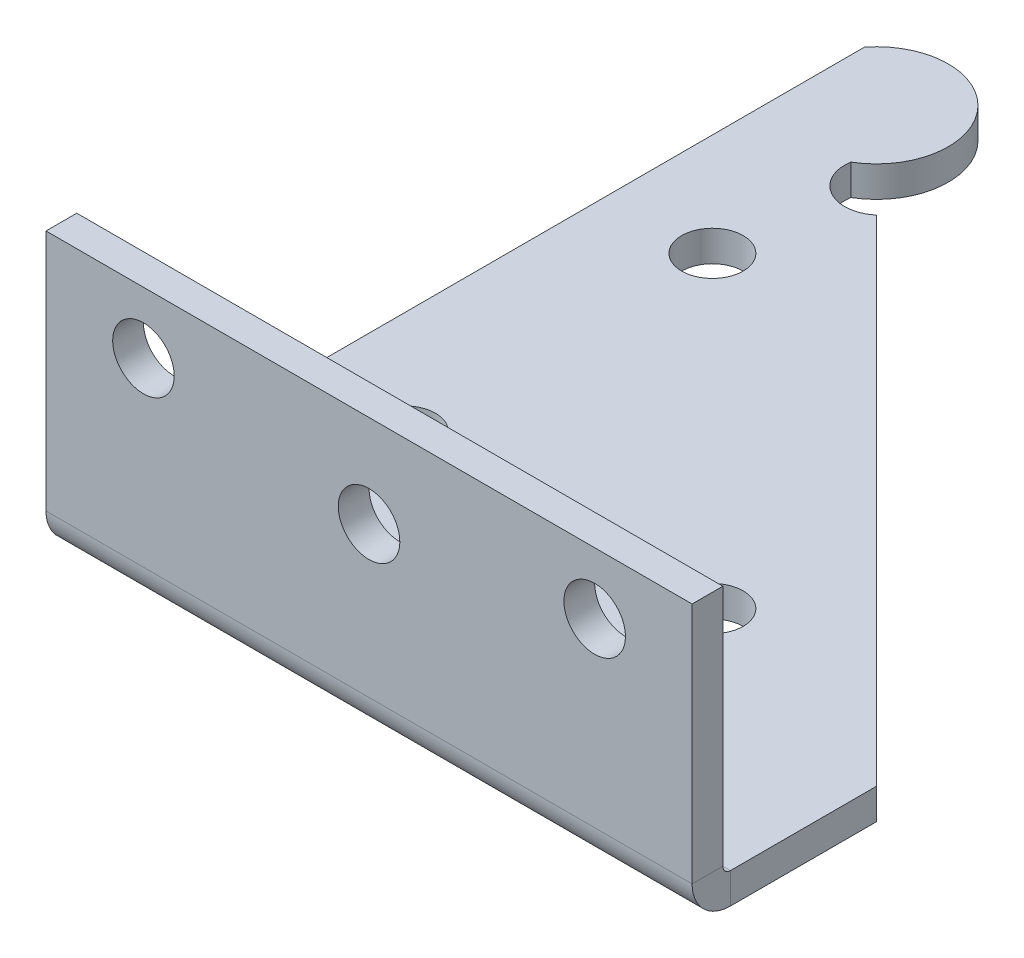
ISO-10303-21;
HEADER;
FILE_DESCRIPTION(('STEP AP214'),'2;1');
FILE_NAME('part.step','',(''),(''),'','','');
FILE_SCHEMA(('AUTOMOTIVE_DESIGN { 1 0 10303 214 1 1 1 1 }'));
ENDSEC;
DATA;
#1=APPLICATION_CONTEXT('core data for automotive mechanical design processes');
#2=APPLICATION_PROTOCOL_DEFINITION('international standard','automotive_design',2000,#1);
#3=PRODUCT_CONTEXT('',#1,'mechanical');
#4=PRODUCT('Part','Part','',(#3));
#5=PRODUCT_RELATED_PRODUCT_CATEGORY('part','',(#4));
#6=PRODUCT_DEFINITION_FORMATION('','',#4);
#7=PRODUCT_DEFINITION_CONTEXT('part definition',#1,'design');
#8=PRODUCT_DEFINITION('design','',#6,#7);
#9=PRODUCT_DEFINITION_SHAPE('','',#8);
#10=(LENGTH_UNIT() NAMED_UNIT(*) SI_UNIT(.MILLI.,.METRE.));
#11=(NAMED_UNIT(*) PLANE_ANGLE_UNIT() SI_UNIT($,.RADIAN.));
#12=(NAMED_UNIT(*) SI_UNIT($,.STERADIAN.) SOLID_ANGLE_UNIT());
#13=UNCERTAINTY_MEASURE_WITH_UNIT(LENGTH_MEASURE(1.E-05),#10,'distance_accuracy_value','');
#14=(GEOMETRIC_REPRESENTATION_CONTEXT(3) GLOBAL_UNCERTAINTY_ASSIGNED_CONTEXT((#13)) GLOBAL_UNIT_ASSIGNED_CONTEXT((#10,
#11,#12)) REPRESENTATION_CONTEXT('',''));
#15=CARTESIAN_POINT('',(0.,0.,0.));
#16=DIRECTION('',(0.,0.,1.));
#17=DIRECTION('',(1.,0.,0.));
#18=AXIS2_PLACEMENT_3D('',#15,#16,#17);
#19=CARTESIAN_POINT('',(5.50000000000001,-74.5200215322547,-23.4200215322545));
#20=DIRECTION('',(0.,0.,-1.));
#21=DIRECTION('',(0.,1.,0.));
#22=AXIS2_PLACEMENT_3D('',#19,#20,#21);
#23=PLANE('',#22);
#24=CARTESIAN_POINT('',(53.5,18.3799784677453,-23.4200215322548));
#25=DIRECTION('',(0.,0.,-1.));
#26=DIRECTION('',(0.,1.,0.));
#27=AXIS2_PLACEMENT_3D('',#24,#25,#26);
#28=CIRCLE('',#27,3.);
#29=CARTESIAN_POINT('',(53.5,21.3799784677453,-23.4200215322548));
#30=VERTEX_POINT('',#29);
#31=EDGE_CURVE('E213',#30,#30,#28,.T.);
#32=ORIENTED_EDGE('',*,*,#31,.T.);
#33=EDGE_LOOP('',(#32));
#34=FACE_BOUND('',#33,.T.);
#35=CARTESIAN_POINT('',(9.5,18.3799784677453,-23.4200215322548));
#36=DIRECTION('',(0.,0.,-1.));
#37=DIRECTION('',(0.,1.,0.));
#38=AXIS2_PLACEMENT_3D('',#35,#36,#37);
#39=CIRCLE('',#38,3.);
#40=CARTESIAN_POINT('',(9.5,21.3799784677453,-23.4200215322548));
#41=VERTEX_POINT('',#40);
#42=EDGE_CURVE('E207',#41,#41,#39,.T.);
#43=ORIENTED_EDGE('',*,*,#42,.T.);
#44=EDGE_LOOP('',(#43));
#45=FACE_BOUND('',#44,.T.);
#46=CARTESIAN_POINT('',(31.5,15.3799784677453,-23.4200215322548));
#47=DIRECTION('',(0.,0.,-1.));
#48=DIRECTION('',(0.,1.,0.));
#49=AXIS2_PLACEMENT_3D('',#46,#47,#48);
#50=CIRCLE('',#49,3.);
#51=CARTESIAN_POINT('',(31.5,18.3799784677453,-23.4200215322548));
#52=VERTEX_POINT('',#51);
#53=EDGE_CURVE('E200',#52,#52,#50,.T.);
#54=ORIENTED_EDGE('',*,*,#53,.T.);
#55=EDGE_LOOP('',(#54));
#56=FACE_BOUND('',#55,.T.);
#57=DIRECTION('',(0.,1.,0.));
#58=VECTOR('',#57,1.);
#59=CARTESIAN_POINT('',(0.,24.3799784677453,-23.4200215322548));
#60=LINE('',#59,#58);
#61=CARTESIAN_POINT('',(0.,0.736600000000011,-23.4200215322547));
#62=VERTEX_POINT('',#61);
#63=CARTESIAN_POINT('',(0.,24.3799784677453,-23.4200215322548));
#64=VERTEX_POINT('',#63);
#65=EDGE_CURVE('E47',#62,#64,#60,.T.);
#66=ORIENTED_EDGE('',*,*,#65,.F.);
#67=DIRECTION('',(1.,0.,0.));
#68=VECTOR('',#67,1.);
#69=CARTESIAN_POINT('',(5.50000000000001,0.736600000000014,-23.4200215322547));
#70=LINE('',#69,#68);
#71=CARTESIAN_POINT('',(63.,0.736600000000011,-23.4200215322547));
#72=VERTEX_POINT('',#71);
#73=EDGE_CURVE('E146',#62,#72,#70,.T.);
#74=ORIENTED_EDGE('',*,*,#73,.T.);
#75=DIRECTION('',(0.,-1.,0.));
#76=VECTOR('',#75,1.);
#77=CARTESIAN_POINT('',(63.,24.3799784677453,-23.4200215322548));
#78=LINE('',#77,#76);
#79=CARTESIAN_POINT('',(63.,24.3799784677453,-23.4200215322548));
#80=VERTEX_POINT('',#79);
#81=EDGE_CURVE('E219',#80,#72,#78,.T.);
#82=ORIENTED_EDGE('',*,*,#81,.F.);
#83=DIRECTION('',(1.,0.,0.));
#84=VECTOR('',#83,1.);
#85=CARTESIAN_POINT('',(0.,24.3799784677453,-23.4200215322548));
#86=LINE('',#85,#84);
#87=EDGE_CURVE('E216',#64,#80,#86,.T.);
#88=ORIENTED_EDGE('',*,*,#87,.F.);
#89=EDGE_LOOP('',(#66,#74,#82,#88));
#90=FACE_BOUND('',#89,.T.);
#91=ADVANCED_FACE('F43',(#34,#45,#56,#90),#23,.F.);
#92=CARTESIAN_POINT('',(0.,24.3799784677453,-23.4200215322548));
#93=DIRECTION('',(-1.,0.,0.));
#94=DIRECTION('',(0.,1.,0.));
#95=AXIS2_PLACEMENT_3D('',#92,#93,#94);
#96=PLANE('',#95);
#97=DIRECTION('',(0.,0.,-1.));
#98=VECTOR('',#97,1.);
#99=CARTESIAN_POINT('',(0.,0.736600000000025,-23.4200215322547));
#100=LINE('',#99,#98);
#101=CARTESIAN_POINT('',(0.,0.7366,-26.4200215322547));
#102=VERTEX_POINT('',#101);
#103=EDGE_CURVE('E227',#62,#102,#100,.T.);
#104=ORIENTED_EDGE('',*,*,#103,.F.);
#105=ORIENTED_EDGE('',*,*,#65,.T.);
#106=DIRECTION('',(0.,0.,-1.));
#107=VECTOR('',#106,1.);
#108=CARTESIAN_POINT('',(0.,24.3799784677453,-23.4200215322548));
#109=LINE('',#108,#107);
#110=CARTESIAN_POINT('',(0.,24.3799784677453,-26.4200215322548));
#111=VERTEX_POINT('',#110);
#112=EDGE_CURVE('E224',#64,#111,#109,.T.);
#113=ORIENTED_EDGE('',*,*,#112,.T.);
#114=DIRECTION('',(0.,1.,0.));
#115=VECTOR('',#114,1.);
#116=CARTESIAN_POINT('',(0.,24.3799784677453,-26.4200215322548));
#117=LINE('',#116,#115);
#118=EDGE_CURVE('E68',#102,#111,#117,.T.);
#119=ORIENTED_EDGE('',*,*,#118,.F.);
#120=EDGE_LOOP('',(#104,#105,#113,#119));
#121=FACE_BOUND('',#120,.T.);
#122=ADVANCED_FACE('F236',(#121),#96,.T.);
#123=CARTESIAN_POINT('',(63.,24.3799784677453,-23.4200215322548));
#124=DIRECTION('',(1.,0.,0.));
#125=DIRECTION('',(0.,-1.,0.));
#126=AXIS2_PLACEMENT_3D('',#123,#124,#125);
#127=PLANE('',#126);
#128=DIRECTION('',(0.,0.,1.));
#129=VECTOR('',#128,1.);
#130=CARTESIAN_POINT('',(63.,0.736600000000025,-23.4200215322548));
#131=LINE('',#130,#129);
#132=CARTESIAN_POINT('',(63.,0.736600000000007,-26.4200215322548));
#133=VERTEX_POINT('',#132);
#134=EDGE_CURVE('E12',#133,#72,#131,.T.);
#135=ORIENTED_EDGE('',*,*,#134,.F.);
#136=DIRECTION('',(0.,-1.,0.));
#137=VECTOR('',#136,1.);
#138=CARTESIAN_POINT('',(63.,24.3799784677453,-26.4200215322548));
#139=LINE('',#138,#137);
#140=CARTESIAN_POINT('',(63.,24.3799784677453,-26.4200215322548));
#141=VERTEX_POINT('',#140);
#142=EDGE_CURVE('E60',#141,#133,#139,.T.);
#143=ORIENTED_EDGE('',*,*,#142,.F.);
#144=DIRECTION('',(0.,0.,-1.));
#145=VECTOR('',#144,1.);
#146=CARTESIAN_POINT('',(63.,24.3799784677453,-23.4200215322548));
#147=LINE('',#146,#145);
#148=EDGE_CURVE('E222',#80,#141,#147,.T.);
#149=ORIENTED_EDGE('',*,*,#148,.F.);
#150=ORIENTED_EDGE('',*,*,#81,.T.);
#151=EDGE_LOOP('',(#135,#143,#149,#150));
#152=FACE_BOUND('',#151,.T.);
#153=ADVANCED_FACE('F45',(#152),#127,.T.);
#154=CARTESIAN_POINT('',(0.,24.3799784677453,-23.4200215322548));
#155=DIRECTION('',(0.,1.,0.));
#156=DIRECTION('',(1.,0.,0.));
#157=AXIS2_PLACEMENT_3D('',#154,#155,#156);
#158=PLANE('',#157);
#159=DIRECTION('',(1.,0.,0.));
#160=VECTOR('',#159,1.);
#161=CARTESIAN_POINT('',(0.,24.3799784677453,-26.4200215322548));
#162=LINE('',#161,#160);
#163=EDGE_CURVE('E220',#111,#141,#162,.T.);
#164=ORIENTED_EDGE('',*,*,#163,.F.);
#165=ORIENTED_EDGE('',*,*,#112,.F.);
#166=ORIENTED_EDGE('',*,*,#87,.T.);
#167=ORIENTED_EDGE('',*,*,#148,.T.);
#168=EDGE_LOOP('',(#164,#165,#166,#167));
#169=FACE_BOUND('',#168,.T.);
#170=ADVANCED_FACE('F239',(#169),#158,.T.);
#171=CARTESIAN_POINT('',(5.50000000000001,-74.5200215322547,-26.4200215322545));
#172=DIRECTION('',(0.,0.,-1.));
#173=DIRECTION('',(0.,1.,0.));
#174=AXIS2_PLACEMENT_3D('',#171,#172,#173);
#175=PLANE('',#174);
#176=DIRECTION('',(1.,0.,0.));
#177=VECTOR('',#176,1.);
#178=CARTESIAN_POINT('',(5.50000000000001,0.736600000000004,-26.4200215322547));
#179=LINE('',#178,#177);
#180=EDGE_CURVE('E52',#102,#133,#179,.T.);
#181=ORIENTED_EDGE('',*,*,#180,.F.);
#182=ORIENTED_EDGE('',*,*,#118,.T.);
#183=ORIENTED_EDGE('',*,*,#163,.T.);
#184=ORIENTED_EDGE('',*,*,#142,.T.);
#185=EDGE_LOOP('',(#181,#182,#183,#184));
#186=FACE_BOUND('',#185,.T.);
#187=CARTESIAN_POINT('',(31.5,15.3799784677453,-26.4200215322548));
#188=DIRECTION('',(0.,0.,-1.));
#189=DIRECTION('',(0.,1.,0.));
#190=AXIS2_PLACEMENT_3D('',#187,#188,#189);
#191=CIRCLE('',#190,3.);
#192=CARTESIAN_POINT('',(31.5,18.3799784677453,-26.4200215322548));
#193=VERTEX_POINT('',#192);
#194=EDGE_CURVE('E197',#193,#193,#191,.T.);
#195=ORIENTED_EDGE('',*,*,#194,.F.);
#196=EDGE_LOOP('',(#195));
#197=FACE_BOUND('',#196,.T.);
#198=CARTESIAN_POINT('',(9.5,18.3799784677453,-26.4200215322548));
#199=DIRECTION('',(0.,0.,-1.));
#200=DIRECTION('',(0.,1.,0.));
#201=AXIS2_PLACEMENT_3D('',#198,#199,#200);
#202=CIRCLE('',#201,3.);
#203=CARTESIAN_POINT('',(9.5,21.3799784677453,-26.4200215322548));
#204=VERTEX_POINT('',#203);
#205=EDGE_CURVE('E204',#204,#204,#202,.T.);
#206=ORIENTED_EDGE('',*,*,#205,.F.);
#207=EDGE_LOOP('',(#206));
#208=FACE_BOUND('',#207,.T.);
#209=CARTESIAN_POINT('',(53.5,18.3799784677453,-26.4200215322548));
#210=DIRECTION('',(0.,0.,-1.));
#211=DIRECTION('',(0.,1.,0.));
#212=AXIS2_PLACEMENT_3D('',#209,#210,#211);
#213=CIRCLE('',#212,3.);
#214=CARTESIAN_POINT('',(53.5,21.3799784677453,-26.4200215322548));
#215=VERTEX_POINT('',#214);
#216=EDGE_CURVE('E210',#215,#215,#213,.T.);
#217=ORIENTED_EDGE('',*,*,#216,.F.);
#218=EDGE_LOOP('',(#217));
#219=FACE_BOUND('',#218,.T.);
#220=ADVANCED_FACE('F232',(#186,#197,#208,#219),#175,.T.);
#221=CARTESIAN_POINT('',(53.5,18.3799784677453,-20.4200215322548));
#222=DIRECTION('',(0.,0.,-1.));
#223=DIRECTION('',(0.,1.,0.));
#224=AXIS2_PLACEMENT_3D('',#221,#222,#223);
#225=CYLINDRICAL_SURFACE('',#224,3.);
#226=ORIENTED_EDGE('',*,*,#216,.T.);
#227=EDGE_LOOP('',(#226));
#228=FACE_BOUND('',#227,.T.);
#229=ORIENTED_EDGE('',*,*,#31,.F.);
#230=EDGE_LOOP('',(#229));
#231=FACE_BOUND('',#230,.T.);
#232=ADVANCED_FACE('F307',(#228,#231),#225,.F.);
#233=CARTESIAN_POINT('',(9.5,18.3799784677453,-20.4200215322548));
#234=DIRECTION('',(0.,0.,-1.));
#235=DIRECTION('',(0.,1.,0.));
#236=AXIS2_PLACEMENT_3D('',#233,#234,#235);
#237=CYLINDRICAL_SURFACE('',#236,3.);
#238=ORIENTED_EDGE('',*,*,#205,.T.);
#239=EDGE_LOOP('',(#238));
#240=FACE_BOUND('',#239,.T.);
#241=ORIENTED_EDGE('',*,*,#42,.F.);
#242=EDGE_LOOP('',(#241));
#243=FACE_BOUND('',#242,.T.);
#244=ADVANCED_FACE('F312',(#240,#243),#237,.F.);
#245=CARTESIAN_POINT('',(31.5,15.3799784677453,-20.4200215322548));
#246=DIRECTION('',(0.,0.,-1.));
#247=DIRECTION('',(0.,1.,0.));
#248=AXIS2_PLACEMENT_3D('',#245,#246,#247);
#249=CYLINDRICAL_SURFACE('',#248,3.);
#250=ORIENTED_EDGE('',*,*,#194,.T.);
#251=EDGE_LOOP('',(#250));
#252=FACE_BOUND('',#251,.T.);
#253=ORIENTED_EDGE('',*,*,#53,.F.);
#254=EDGE_LOOP('',(#253));
#255=FACE_BOUND('',#254,.T.);
#256=ADVANCED_FACE('F468',(#252,#255),#249,.F.);
#257=CARTESIAN_POINT('',(40.,-3.,-48.4));
#258=DIRECTION('',(0.,1.,0.));
#259=DIRECTION('',(0.,0.,1.));
#260=AXIS2_PLACEMENT_3D('',#257,#258,#259);
#261=CYLINDRICAL_SURFACE('',#260,3.);
#262=CARTESIAN_POINT('',(40.,-3.,-48.4));
#263=DIRECTION('',(0.,1.,0.));
#264=DIRECTION('',(0.,0.,1.));
#265=AXIS2_PLACEMENT_3D('',#262,#263,#264);
#266=CIRCLE('',#265,3.);
#267=CARTESIAN_POINT('',(40.,-3.,-45.4));
#268=VERTEX_POINT('',#267);
#269=EDGE_CURVE('E164',#268,#268,#266,.T.);
#270=ORIENTED_EDGE('',*,*,#269,.F.);
#271=EDGE_LOOP('',(#270));
#272=FACE_BOUND('',#271,.T.);
#273=CARTESIAN_POINT('',(40.,0.,-48.4));
#274=DIRECTION('',(0.,1.,0.));
#275=DIRECTION('',(0.,0.,1.));
#276=AXIS2_PLACEMENT_3D('',#273,#274,#275);
#277=CIRCLE('',#276,3.);
#278=CARTESIAN_POINT('',(40.,0.,-45.4));
#279=VERTEX_POINT('',#278);
#280=EDGE_CURVE('E160',#279,#279,#277,.T.);
#281=ORIENTED_EDGE('',*,*,#280,.T.);
#282=EDGE_LOOP('',(#281));
#283=FACE_BOUND('',#282,.T.);
#284=ADVANCED_FACE('F459',(#272,#283),#261,.F.);
#285=CARTESIAN_POINT('',(10.,-3.,-48.4));
#286=DIRECTION('',(0.,1.,0.));
#287=DIRECTION('',(0.,0.,1.));
#288=AXIS2_PLACEMENT_3D('',#285,#286,#287);
#289=CYLINDRICAL_SURFACE('',#288,3.);
#290=CARTESIAN_POINT('',(10.,-3.,-48.4));
#291=DIRECTION('',(0.,1.,0.));
#292=DIRECTION('',(0.,0.,1.));
#293=AXIS2_PLACEMENT_3D('',#290,#291,#292);
#294=CIRCLE('',#293,3.);
#295=CARTESIAN_POINT('',(10.,-3.,-45.4));
#296=VERTEX_POINT('',#295);
#297=EDGE_CURVE('E167',#296,#296,#294,.T.);
#298=ORIENTED_EDGE('',*,*,#297,.F.);
#299=EDGE_LOOP('',(#298));
#300=FACE_BOUND('',#299,.T.);
#301=CARTESIAN_POINT('',(10.,0.,-48.4));
#302=DIRECTION('',(0.,1.,0.));
#303=DIRECTION('',(0.,0.,1.));
#304=AXIS2_PLACEMENT_3D('',#301,#302,#303);
#305=CIRCLE('',#304,3.);
#306=CARTESIAN_POINT('',(10.,0.,-45.4));
#307=VERTEX_POINT('',#306);
#308=EDGE_CURVE('E192',#307,#307,#305,.T.);
#309=ORIENTED_EDGE('',*,*,#308,.T.);
#310=EDGE_LOOP('',(#309));
#311=FACE_BOUND('',#310,.T.);
#312=ADVANCED_FACE('F449',(#300,#311),#289,.F.);
#313=CARTESIAN_POINT('',(10.,-6.,-78.4));
#314=DIRECTION('',(0.,1.,0.));
#315=DIRECTION('',(0.,0.,1.));
#316=AXIS2_PLACEMENT_3D('',#313,#314,#315);
#317=CYLINDRICAL_SURFACE('',#316,3.);
#318=CARTESIAN_POINT('',(10.,0.,-78.4));
#319=DIRECTION('',(0.,1.,0.));
#320=DIRECTION('',(0.,0.,1.));
#321=AXIS2_PLACEMENT_3D('',#318,#319,#320);
#322=CIRCLE('',#321,3.);
#323=CARTESIAN_POINT('',(10.,0.,-75.4));
#324=VERTEX_POINT('',#323);
#325=EDGE_CURVE('E189',#324,#324,#322,.T.);
#326=ORIENTED_EDGE('',*,*,#325,.T.);
#327=EDGE_LOOP('',(#326));
#328=FACE_BOUND('',#327,.T.);
#329=CARTESIAN_POINT('',(10.,-3.,-78.4));
#330=DIRECTION('',(0.,1.,0.));
#331=DIRECTION('',(0.,0.,1.));
#332=AXIS2_PLACEMENT_3D('',#329,#330,#331);
#333=CIRCLE('',#332,3.);
#334=CARTESIAN_POINT('',(10.,-3.,-75.4));
#335=VERTEX_POINT('',#334);
#336=EDGE_CURVE('E173',#335,#335,#333,.T.);
#337=ORIENTED_EDGE('',*,*,#336,.F.);
#338=EDGE_LOOP('',(#337));
#339=FACE_BOUND('',#338,.T.);
#340=ADVANCED_FACE('F346',(#328,#339),#317,.F.);
#341=CARTESIAN_POINT('',(63.,-3.,-41.4));
#342=DIRECTION('',(0.707106781186546,0.,-0.707106781186549));
#343=DIRECTION('',(-0.707106781186549,0.,-0.707106781186546));
#344=AXIS2_PLACEMENT_3D('',#341,#342,#343);
#345=PLANE('',#344);
#346=DIRECTION('',(-0.707106781186549,0.,-0.707106781186546));
#347=VECTOR('',#346,1.);
#348=CARTESIAN_POINT('',(63.,0.,-41.4));
#349=LINE('',#348,#347);
#350=CARTESIAN_POINT('',(63.,0.,-41.4));
#351=VERTEX_POINT('',#350);
#352=CARTESIAN_POINT('',(14.7667792767087,0.,-89.6332207232911));
#353=VERTEX_POINT('',#352);
#354=EDGE_CURVE('E267',#351,#353,#349,.T.);
#355=ORIENTED_EDGE('',*,*,#354,.F.);
#356=DIRECTION('',(0.,1.,0.));
#357=VECTOR('',#356,1.);
#358=CARTESIAN_POINT('',(63.,-3.,-41.4));
#359=LINE('',#358,#357);
#360=CARTESIAN_POINT('',(63.,-3.,-41.4));
#361=VERTEX_POINT('',#360);
#362=EDGE_CURVE('E201',#361,#351,#359,.T.);
#363=ORIENTED_EDGE('',*,*,#362,.F.);
#364=DIRECTION('',(-0.707106781186549,0.,-0.707106781186546));
#365=VECTOR('',#364,1.);
#366=CARTESIAN_POINT('',(63.,-3.,-41.4));
#367=LINE('',#366,#365);
#368=CARTESIAN_POINT('',(14.7667792767087,-3.,-89.6332207232911));
#369=VERTEX_POINT('',#368);
#370=EDGE_CURVE('E186',#361,#369,#367,.T.);
#371=ORIENTED_EDGE('',*,*,#370,.T.);
#372=DIRECTION('',(0.,1.,0.));
#373=VECTOR('',#372,1.);
#374=CARTESIAN_POINT('',(14.7667792767087,-3.,-89.6332207232911));
#375=LINE('',#374,#373);
#376=EDGE_CURVE('E184',#369,#353,#375,.T.);
#377=ORIENTED_EDGE('',*,*,#376,.T.);
#378=EDGE_LOOP('',(#355,#363,#371,#377));
#379=FACE_BOUND('',#378,.T.);
#380=ADVANCED_FACE('F283',(#379),#345,.T.);
#381=CARTESIAN_POINT('',(12.5,-3.,-92.3));
#382=DIRECTION('',(0.,1.,0.));
#383=DIRECTION('',(0.,0.,1.));
#384=AXIS2_PLACEMENT_3D('',#381,#382,#383);
#385=CYLINDRICAL_SURFACE('',#384,3.5);
#386=CARTESIAN_POINT('',(12.5,0.,-92.3));
#387=DIRECTION('',(0.,-1.,0.));
#388=DIRECTION('',(0.,0.,1.));
#389=AXIS2_PLACEMENT_3D('',#386,#387,#388);
#390=CIRCLE('',#389,3.5);
#391=CARTESIAN_POINT('',(9.04582465159614,0.,-92.8645109941171));
#392=VERTEX_POINT('',#391);
#393=EDGE_CURVE('E264',#353,#392,#390,.T.);
#394=ORIENTED_EDGE('',*,*,#393,.F.);
#395=ORIENTED_EDGE('',*,*,#376,.F.);
#396=CARTESIAN_POINT('',(12.5,-3.,-92.3));
#397=DIRECTION('',(0.,-1.,0.));
#398=DIRECTION('',(0.,0.,1.));
#399=AXIS2_PLACEMENT_3D('',#396,#397,#398);
#400=CIRCLE('',#399,3.5);
#401=CARTESIAN_POINT('',(9.04582465159614,-3.,-92.8645109941171));
#402=VERTEX_POINT('',#401);
#403=EDGE_CURVE('E181',#369,#402,#400,.T.);
#404=ORIENTED_EDGE('',*,*,#403,.T.);
#405=DIRECTION('',(0.,1.,0.));
#406=VECTOR('',#405,1.);
#407=CARTESIAN_POINT('',(9.04582465159614,-3.,-92.8645109941171));
#408=LINE('',#407,#406);
#409=EDGE_CURVE('E179',#402,#392,#408,.T.);
#410=ORIENTED_EDGE('',*,*,#409,.T.);
#411=EDGE_LOOP('',(#394,#395,#404,#410));
#412=FACE_BOUND('',#411,.T.);
#413=ADVANCED_FACE('F345',(#412),#385,.F.);
#414=CARTESIAN_POINT('',(5.5,-3.,-98.9));
#415=DIRECTION('',(0.,1.,0.));
#416=DIRECTION('',(0.,0.,1.));
#417=AXIS2_PLACEMENT_3D('',#414,#415,#416);
#418=CYLINDRICAL_SURFACE('',#417,7.00000000000001);
#419=CARTESIAN_POINT('',(5.5,0.,-98.9));
#420=DIRECTION('',(0.,1.,0.));
#421=DIRECTION('',(0.,0.,1.));
#422=AXIS2_PLACEMENT_3D('',#419,#420,#421);
#423=CIRCLE('',#422,7.00000000000001);
#424=CARTESIAN_POINT('',(0.,0.,-103.230127018922));
#425=VERTEX_POINT('',#424);
#426=EDGE_CURVE('E261',#392,#425,#423,.T.);
#427=ORIENTED_EDGE('',*,*,#426,.F.);
#428=ORIENTED_EDGE('',*,*,#409,.F.);
#429=CARTESIAN_POINT('',(5.5,-3.,-98.9));
#430=DIRECTION('',(0.,1.,0.));
#431=DIRECTION('',(0.,0.,1.));
#432=AXIS2_PLACEMENT_3D('',#429,#430,#431);
#433=CIRCLE('',#432,7.00000000000001);
#434=CARTESIAN_POINT('',(0.,-3.,-103.230127018922));
#435=VERTEX_POINT('',#434);
#436=EDGE_CURVE('E177',#402,#435,#433,.T.);
#437=ORIENTED_EDGE('',*,*,#436,.T.);
#438=DIRECTION('',(0.,1.,0.));
#439=VECTOR('',#438,1.);
#440=CARTESIAN_POINT('',(0.,-3.,-103.230127018922));
#441=LINE('',#440,#439);
#442=EDGE_CURVE('E163',#435,#425,#441,.T.);
#443=ORIENTED_EDGE('',*,*,#442,.T.);
#444=EDGE_LOOP('',(#427,#428,#437,#443));
#445=FACE_BOUND('',#444,.T.);
#446=ADVANCED_FACE('F277',(#445),#418,.T.);
#447=CARTESIAN_POINT('',(5.5,-3.,-98.9));
#448=DIRECTION('',(0.,1.,0.));
#449=DIRECTION('',(0.,0.,1.));
#450=AXIS2_PLACEMENT_3D('',#447,#448,#449);
#451=PLANE('',#450);
#452=DIRECTION('',(1.,0.,0.));
#453=VECTOR('',#452,1.);
#454=CARTESIAN_POINT('',(5.50000000000001,-3.,-27.1566215322547));
#455=LINE('',#454,#453);
#456=CARTESIAN_POINT('',(0.,-3.,-27.1566215322547));
#457=VERTEX_POINT('',#456);
#458=CARTESIAN_POINT('',(63.,-3.,-27.1566215322547));
#459=VERTEX_POINT('',#458);
#460=EDGE_CURVE('E143',#457,#459,#455,.T.);
#461=ORIENTED_EDGE('',*,*,#460,.F.);
#462=DIRECTION('',(0.,0.,1.));
#463=VECTOR('',#462,1.);
#464=CARTESIAN_POINT('',(0.,-3.,0.));
#465=LINE('',#464,#463);
#466=EDGE_CURVE('E137',#435,#457,#465,.T.);
#467=ORIENTED_EDGE('',*,*,#466,.F.);
#468=ORIENTED_EDGE('',*,*,#436,.F.);
#469=ORIENTED_EDGE('',*,*,#403,.F.);
#470=ORIENTED_EDGE('',*,*,#370,.F.);
#471=DIRECTION('',(0.,0.,-1.));
#472=VECTOR('',#471,1.);
#473=CARTESIAN_POINT('',(63.,-3.,0.));
#474=LINE('',#473,#472);
#475=EDGE_CURVE('E158',#459,#361,#474,.T.);
#476=ORIENTED_EDGE('',*,*,#475,.F.);
#477=EDGE_LOOP('',(#461,#467,#468,#469,#470,#476));
#478=FACE_BOUND('',#477,.T.);
#479=ORIENTED_EDGE('',*,*,#336,.T.);
#480=EDGE_LOOP('',(#479));
#481=FACE_BOUND('',#480,.T.);
#482=ORIENTED_EDGE('',*,*,#297,.T.);
#483=EDGE_LOOP('',(#482));
#484=FACE_BOUND('',#483,.T.);
#485=ORIENTED_EDGE('',*,*,#269,.T.);
#486=EDGE_LOOP('',(#485));
#487=FACE_BOUND('',#486,.T.);
#488=ADVANCED_FACE('F153',(#478,#481,#484,#487),#451,.F.);
#489=CARTESIAN_POINT('',(0.,-3.,0.));
#490=DIRECTION('',(-1.,0.,0.));
#491=DIRECTION('',(0.,0.,1.));
#492=AXIS2_PLACEMENT_3D('',#489,#490,#491);
#493=PLANE('',#492);
#494=ORIENTED_EDGE('',*,*,#466,.T.);
#495=DIRECTION('',(0.,1.,0.));
#496=VECTOR('',#495,1.);
#497=CARTESIAN_POINT('',(0.,-3.,-27.1566215322547));
#498=LINE('',#497,#496);
#499=CARTESIAN_POINT('',(0.,0.,-27.1566215322547));
#500=VERTEX_POINT('',#499);
#501=EDGE_CURVE('E124',#457,#500,#498,.T.);
#502=ORIENTED_EDGE('',*,*,#501,.T.);
#503=DIRECTION('',(0.,0.,1.));
#504=VECTOR('',#503,1.);
#505=CARTESIAN_POINT('',(0.,0.,0.));
#506=LINE('',#505,#504);
#507=EDGE_CURVE('E136',#425,#500,#506,.T.);
#508=ORIENTED_EDGE('',*,*,#507,.F.);
#509=ORIENTED_EDGE('',*,*,#442,.F.);
#510=EDGE_LOOP('',(#494,#502,#508,#509));
#511=FACE_BOUND('',#510,.T.);
#512=ADVANCED_FACE('F162',(#511),#493,.T.);
#513=CARTESIAN_POINT('',(5.5,0.,-98.9));
#514=DIRECTION('',(0.,1.,0.));
#515=DIRECTION('',(0.,0.,1.));
#516=AXIS2_PLACEMENT_3D('',#513,#514,#515);
#517=PLANE('',#516);
#518=ORIENTED_EDGE('',*,*,#280,.F.);
#519=EDGE_LOOP('',(#518));
#520=FACE_BOUND('',#519,.T.);
#521=ORIENTED_EDGE('',*,*,#308,.F.);
#522=EDGE_LOOP('',(#521));
#523=FACE_BOUND('',#522,.T.);
#524=ORIENTED_EDGE('',*,*,#325,.F.);
#525=EDGE_LOOP('',(#524));
#526=FACE_BOUND('',#525,.T.);
#527=ORIENTED_EDGE('',*,*,#507,.T.);
#528=DIRECTION('',(1.,0.,0.));
#529=VECTOR('',#528,1.);
#530=CARTESIAN_POINT('',(5.50000000000001,0.,-27.1566215322547));
#531=LINE('',#530,#529);
#532=CARTESIAN_POINT('',(63.,0.,-27.1566215322547));
#533=VERTEX_POINT('',#532);
#534=EDGE_CURVE('E252',#500,#533,#531,.T.);
#535=ORIENTED_EDGE('',*,*,#534,.T.);
#536=DIRECTION('',(0.,0.,-1.));
#537=VECTOR('',#536,1.);
#538=CARTESIAN_POINT('',(63.,0.,0.));
#539=LINE('',#538,#537);
#540=EDGE_CURVE('E270',#533,#351,#539,.T.);
#541=ORIENTED_EDGE('',*,*,#540,.T.);
#542=ORIENTED_EDGE('',*,*,#354,.T.);
#543=ORIENTED_EDGE('',*,*,#393,.T.);
#544=ORIENTED_EDGE('',*,*,#426,.T.);
#545=EDGE_LOOP('',(#527,#535,#541,#542,#543,#544));
#546=FACE_BOUND('',#545,.T.);
#547=ADVANCED_FACE('F273',(#520,#523,#526,#546),#517,.T.);
#548=CARTESIAN_POINT('',(63.,-3.,0.));
#549=DIRECTION('',(1.,0.,0.));
#550=DIRECTION('',(0.,0.,-1.));
#551=AXIS2_PLACEMENT_3D('',#548,#549,#550);
#552=PLANE('',#551);
#553=ORIENTED_EDGE('',*,*,#540,.F.);
#554=DIRECTION('',(0.,-1.,0.));
#555=VECTOR('',#554,1.);
#556=CARTESIAN_POINT('',(63.,-3.,-27.1566215322547));
#557=LINE('',#556,#555);
#558=EDGE_CURVE('E246',#533,#459,#557,.T.);
#559=ORIENTED_EDGE('',*,*,#558,.T.);
#560=ORIENTED_EDGE('',*,*,#475,.T.);
#561=ORIENTED_EDGE('',*,*,#362,.T.);
#562=EDGE_LOOP('',(#553,#559,#560,#561));
#563=FACE_BOUND('',#562,.T.);
#564=ADVANCED_FACE('F285',(#563),#552,.T.);
#565=CARTESIAN_POINT('',(0.,0.7366,-27.1566215322547));
#566=DIRECTION('',(-1.,0.,0.));
#567=DIRECTION('',(0.,0.,1.));
#568=AXIS2_PLACEMENT_3D('',#565,#566,#567);
#569=PLANE('',#568);
#570=ORIENTED_EDGE('',*,*,#103,.T.);
#571=CARTESIAN_POINT('',(0.,0.7366,-27.1566215322547));
#572=DIRECTION('',(-1.,0.,0.));
#573=DIRECTION('',(0.,0.,1.));
#574=AXIS2_PLACEMENT_3D('',#571,#572,#573);
#575=CIRCLE('',#574,0.7366);
#576=EDGE_CURVE('E131',#102,#500,#575,.F.);
#577=ORIENTED_EDGE('',*,*,#576,.T.);
#578=ORIENTED_EDGE('',*,*,#501,.F.);
#579=CARTESIAN_POINT('',(0.,0.7366,-27.1566215322547));
#580=DIRECTION('',(1.,0.,0.));
#581=DIRECTION('',(0.,0.,1.));
#582=AXIS2_PLACEMENT_3D('',#579,#580,#581);
#583=CIRCLE('',#582,3.7366);
#584=EDGE_CURVE('E128',#62,#457,#583,.T.);
#585=ORIENTED_EDGE('',*,*,#584,.F.);
#586=EDGE_LOOP('',(#570,#577,#578,#585));
#587=FACE_BOUND('',#586,.T.);
#588=ADVANCED_FACE('F127',(#587),#569,.T.);
#589=CARTESIAN_POINT('',(63.,0.7366,-27.1566215322547));
#590=DIRECTION('',(1.,0.,0.));
#591=DIRECTION('',(0.,0.,-1.));
#592=AXIS2_PLACEMENT_3D('',#589,#590,#591);
#593=PLANE('',#592);
#594=ORIENTED_EDGE('',*,*,#558,.F.);
#595=CARTESIAN_POINT('',(63.,0.7366,-27.1566215322547));
#596=DIRECTION('',(-1.,0.,0.));
#597=DIRECTION('',(0.,0.,1.));
#598=AXIS2_PLACEMENT_3D('',#595,#596,#597);
#599=CIRCLE('',#598,0.7366);
#600=EDGE_CURVE('E148',#533,#133,#599,.T.);
#601=ORIENTED_EDGE('',*,*,#600,.T.);
#602=ORIENTED_EDGE('',*,*,#134,.T.);
#603=CARTESIAN_POINT('',(63.,0.7366,-27.1566215322547));
#604=DIRECTION('',(-1.,0.,0.));
#605=DIRECTION('',(0.,0.,-1.));
#606=AXIS2_PLACEMENT_3D('',#603,#604,#605);
#607=CIRCLE('',#606,3.7366);
#608=EDGE_CURVE('E147',#459,#72,#607,.T.);
#609=ORIENTED_EDGE('',*,*,#608,.F.);
#610=EDGE_LOOP('',(#594,#601,#602,#609));
#611=FACE_BOUND('',#610,.T.);
#612=ADVANCED_FACE('F245',(#611),#593,.T.);
#613=CARTESIAN_POINT('',(94.6691608051771,0.7366,-27.1566215322547));
#614=DIRECTION('',(-1.,0.,0.));
#615=DIRECTION('',(0.,0.,1.));
#616=AXIS2_PLACEMENT_3D('',#613,#614,#615);
#617=CYLINDRICAL_SURFACE('',#616,3.7366);
#618=ORIENTED_EDGE('',*,*,#608,.T.);
#619=ORIENTED_EDGE('',*,*,#73,.F.);
#620=ORIENTED_EDGE('',*,*,#584,.T.);
#621=ORIENTED_EDGE('',*,*,#460,.T.);
#622=EDGE_LOOP('',(#618,#619,#620,#621));
#623=FACE_BOUND('',#622,.T.);
#624=ADVANCED_FACE('F142',(#623),#617,.T.);
#625=CARTESIAN_POINT('',(94.6691608051771,0.7366,-27.1566215322547));
#626=DIRECTION('',(-1.,0.,0.));
#627=DIRECTION('',(0.,0.,1.));
#628=AXIS2_PLACEMENT_3D('',#625,#626,#627);
#629=CYLINDRICAL_SURFACE('',#628,0.7366);
#630=ORIENTED_EDGE('',*,*,#600,.F.);
#631=ORIENTED_EDGE('',*,*,#534,.F.);
#632=ORIENTED_EDGE('',*,*,#576,.F.);
#633=ORIENTED_EDGE('',*,*,#180,.T.);
#634=EDGE_LOOP('',(#630,#631,#632,#633));
#635=FACE_BOUND('',#634,.T.);
#636=ADVANCED_FACE('F250',(#635),#629,.F.);
#637=CLOSED_SHELL('',(#91,#122,#153,#170,#220,#232,#244,#256,#284,#312,#340,#380,#413,#446,#488,
#512,#547,#564,#588,#612,#624,#636));
#638=MANIFOLD_SOLID_BREP('B2',#637);
#639=ADVANCED_BREP_SHAPE_REPRESENTATION('',(#18,#638),#14);
#640=SHAPE_DEFINITION_REPRESENTATION(#9,#639);
ENDSEC;
END-ISO-10303-21;
